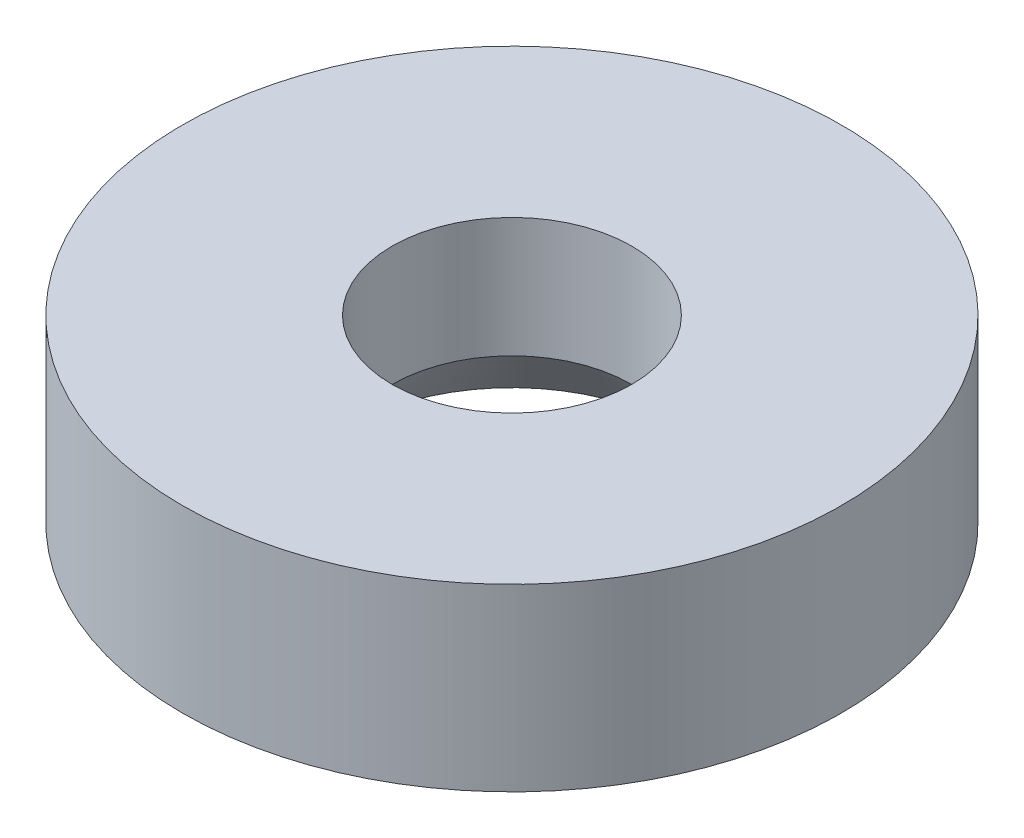
ISO-10303-21;
HEADER;
FILE_DESCRIPTION(('STEP AP214'),'2;1');
FILE_NAME('part.step','',(''),(''),'','','');
FILE_SCHEMA(('AUTOMOTIVE_DESIGN { 1 0 10303 214 1 1 1 1 }'));
ENDSEC;
DATA;
#1=APPLICATION_CONTEXT('core data for automotive mechanical design processes');
#2=APPLICATION_PROTOCOL_DEFINITION('international standard','automotive_design',2000,#1);
#3=PRODUCT_CONTEXT('',#1,'mechanical');
#4=PRODUCT('Part','Part','',(#3));
#5=PRODUCT_RELATED_PRODUCT_CATEGORY('part','',(#4));
#6=PRODUCT_DEFINITION_FORMATION('','',#4);
#7=PRODUCT_DEFINITION_CONTEXT('part definition',#1,'design');
#8=PRODUCT_DEFINITION('design','',#6,#7);
#9=PRODUCT_DEFINITION_SHAPE('','',#8);
#10=(LENGTH_UNIT() NAMED_UNIT(*) SI_UNIT(.MILLI.,.METRE.));
#11=(NAMED_UNIT(*) PLANE_ANGLE_UNIT() SI_UNIT($,.RADIAN.));
#12=(NAMED_UNIT(*) SI_UNIT($,.STERADIAN.) SOLID_ANGLE_UNIT());
#13=UNCERTAINTY_MEASURE_WITH_UNIT(LENGTH_MEASURE(1.E-05),#10,'distance_accuracy_value','');
#14=(GEOMETRIC_REPRESENTATION_CONTEXT(3) GLOBAL_UNCERTAINTY_ASSIGNED_CONTEXT((#13)) GLOBAL_UNIT_ASSIGNED_CONTEXT((#10,
#11,#12)) REPRESENTATION_CONTEXT('',''));
#15=CARTESIAN_POINT('',(0.,0.,0.));
#16=DIRECTION('',(0.,0.,1.));
#17=DIRECTION('',(1.,0.,0.));
#18=AXIS2_PLACEMENT_3D('',#15,#16,#17);
#19=CARTESIAN_POINT('',(0.,1.22881355932203,0.));
#20=DIRECTION('',(0.,1.,0.));
#21=DIRECTION('',(0.,0.,1.));
#22=AXIS2_PLACEMENT_3D('',#19,#20,#21);
#23=CYLINDRICAL_SURFACE('',#22,0.4);
#24=CARTESIAN_POINT('',(0.,0.2,0.));
#25=DIRECTION('',(0.,1.,0.));
#26=DIRECTION('',(0.,0.,1.));
#27=AXIS2_PLACEMENT_3D('',#24,#25,#26);
#28=CIRCLE('',#27,0.4);
#29=CARTESIAN_POINT('',(0.,0.2,0.4));
#30=VERTEX_POINT('',#29);
#31=EDGE_CURVE('E54',#30,#30,#28,.T.);
#32=ORIENTED_EDGE('',*,*,#31,.F.);
#33=EDGE_LOOP('',(#32));
#34=FACE_BOUND('',#33,.T.);
#35=CARTESIAN_POINT('',(0.,0.6,0.));
#36=DIRECTION('',(0.,1.,0.));
#37=DIRECTION('',(0.,0.,1.));
#38=AXIS2_PLACEMENT_3D('',#35,#36,#37);
#39=CIRCLE('',#38,0.4);
#40=CARTESIAN_POINT('',(0.,0.6,0.4));
#41=VERTEX_POINT('',#40);
#42=EDGE_CURVE('E10',#41,#41,#39,.T.);
#43=ORIENTED_EDGE('',*,*,#42,.T.);
#44=EDGE_LOOP('',(#43));
#45=FACE_BOUND('',#44,.T.);
#46=ADVANCED_FACE('F35',(#34,#45),#23,.F.);
#47=CARTESIAN_POINT('',(0.4,0.6,0.));
#48=DIRECTION('',(0.,-1.,0.));
#49=DIRECTION('',(0.,0.,-1.));
#50=AXIS2_PLACEMENT_3D('',#47,#48,#49);
#51=PLANE('',#50);
#52=ORIENTED_EDGE('',*,*,#42,.F.);
#53=EDGE_LOOP('',(#52));
#54=FACE_BOUND('',#53,.T.);
#55=CARTESIAN_POINT('',(0.,0.6,0.));
#56=DIRECTION('',(0.,1.,0.));
#57=DIRECTION('',(0.,0.,1.));
#58=AXIS2_PLACEMENT_3D('',#55,#56,#57);
#59=CIRCLE('',#58,1.1);
#60=CARTESIAN_POINT('',(0.,0.6,1.1));
#61=VERTEX_POINT('',#60);
#62=EDGE_CURVE('E41',#61,#61,#59,.T.);
#63=ORIENTED_EDGE('',*,*,#62,.T.);
#64=EDGE_LOOP('',(#63));
#65=FACE_BOUND('',#64,.T.);
#66=ADVANCED_FACE('F61',(#54,#65),#51,.F.);
#67=CARTESIAN_POINT('',(0.,1.22881355932203,0.));
#68=DIRECTION('',(0.,1.,0.));
#69=DIRECTION('',(0.,0.,1.));
#70=AXIS2_PLACEMENT_3D('',#67,#68,#69);
#71=CYLINDRICAL_SURFACE('',#70,1.1);
#72=ORIENTED_EDGE('',*,*,#62,.F.);
#73=EDGE_LOOP('',(#72));
#74=FACE_BOUND('',#73,.T.);
#75=CARTESIAN_POINT('',(0.,0.,0.));
#76=DIRECTION('',(0.,1.,0.));
#77=DIRECTION('',(0.,0.,1.));
#78=AXIS2_PLACEMENT_3D('',#75,#76,#77);
#79=CIRCLE('',#78,1.1);
#80=CARTESIAN_POINT('',(0.,0.,1.1));
#81=VERTEX_POINT('',#80);
#82=EDGE_CURVE('E45',#81,#81,#79,.T.);
#83=ORIENTED_EDGE('',*,*,#82,.T.);
#84=EDGE_LOOP('',(#83));
#85=FACE_BOUND('',#84,.T.);
#86=ADVANCED_FACE('F65',(#74,#85),#71,.T.);
#87=CARTESIAN_POINT('',(1.1,0.,0.));
#88=DIRECTION('',(0.,1.,0.));
#89=DIRECTION('',(0.,0.,1.));
#90=AXIS2_PLACEMENT_3D('',#87,#88,#89);
#91=PLANE('',#90);
#92=ORIENTED_EDGE('',*,*,#82,.F.);
#93=EDGE_LOOP('',(#92));
#94=FACE_BOUND('',#93,.T.);
#95=CARTESIAN_POINT('',(0.,0.,0.));
#96=DIRECTION('',(0.,1.,0.));
#97=DIRECTION('',(0.,0.,1.));
#98=AXIS2_PLACEMENT_3D('',#95,#96,#97);
#99=CIRCLE('',#98,0.552542372881356);
#100=CARTESIAN_POINT('',(0.,0.,0.552542372881356));
#101=VERTEX_POINT('',#100);
#102=EDGE_CURVE('E49',#101,#101,#99,.T.);
#103=ORIENTED_EDGE('',*,*,#102,.T.);
#104=EDGE_LOOP('',(#103));
#105=FACE_BOUND('',#104,.T.);
#106=ADVANCED_FACE('F70',(#94,#105),#91,.F.);
#107=CARTESIAN_POINT('',(0.,0.2,0.));
#108=DIRECTION('',(0.,-1.,0.));
#109=DIRECTION('',(0.,0.,-1.));
#110=AXIS2_PLACEMENT_3D('',#107,#108,#109);
#111=CONICAL_SURFACE('',#110,0.4,0.651587185922857);
#112=ORIENTED_EDGE('',*,*,#102,.F.);
#113=EDGE_LOOP('',(#112));
#114=FACE_BOUND('',#113,.T.);
#115=ORIENTED_EDGE('',*,*,#31,.T.);
#116=EDGE_LOOP('',(#115));
#117=FACE_BOUND('',#116,.T.);
#118=ADVANCED_FACE('F58',(#114,#117),#111,.F.);
#119=CLOSED_SHELL('',(#46,#66,#86,#106,#118));
#120=MANIFOLD_SOLID_BREP('B2',#119);
#121=ADVANCED_BREP_SHAPE_REPRESENTATION('',(#18,#120),#14);
#122=SHAPE_DEFINITION_REPRESENTATION(#9,#121);
ENDSEC;
END-ISO-10303-21;
